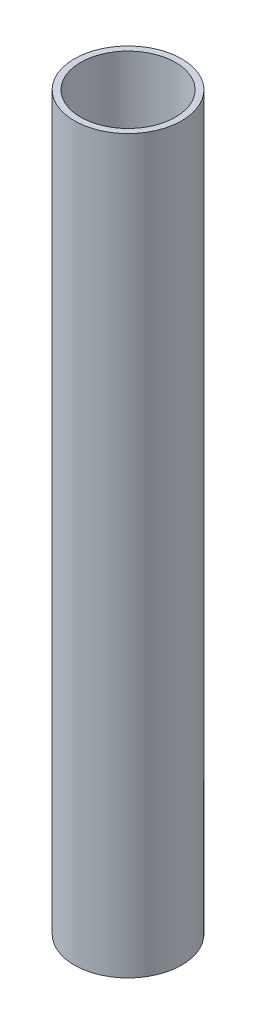
ISO-10303-21;
HEADER;
FILE_DESCRIPTION(('STEP AP214'),'2;1');
FILE_NAME('part.step','',(''),(''),'','','');
FILE_SCHEMA(('AUTOMOTIVE_DESIGN { 1 0 10303 214 1 1 1 1 }'));
ENDSEC;
DATA;
#1=APPLICATION_CONTEXT('core data for automotive mechanical design processes');
#2=APPLICATION_PROTOCOL_DEFINITION('international standard','automotive_design',2000,#1);
#3=PRODUCT_CONTEXT('',#1,'mechanical');
#4=PRODUCT('Part','Part','',(#3));
#5=PRODUCT_RELATED_PRODUCT_CATEGORY('part','',(#4));
#6=PRODUCT_DEFINITION_FORMATION('','',#4);
#7=PRODUCT_DEFINITION_CONTEXT('part definition',#1,'design');
#8=PRODUCT_DEFINITION('design','',#6,#7);
#9=PRODUCT_DEFINITION_SHAPE('','',#8);
#10=(LENGTH_UNIT() NAMED_UNIT(*) SI_UNIT(.MILLI.,.METRE.));
#11=(NAMED_UNIT(*) PLANE_ANGLE_UNIT() SI_UNIT($,.RADIAN.));
#12=(NAMED_UNIT(*) SI_UNIT($,.STERADIAN.) SOLID_ANGLE_UNIT());
#13=UNCERTAINTY_MEASURE_WITH_UNIT(LENGTH_MEASURE(1.E-05),#10,'distance_accuracy_value','');
#14=(GEOMETRIC_REPRESENTATION_CONTEXT(3) GLOBAL_UNCERTAINTY_ASSIGNED_CONTEXT((#13)) GLOBAL_UNIT_ASSIGNED_CONTEXT((#10,
#11,#12)) REPRESENTATION_CONTEXT('',''));
#15=CARTESIAN_POINT('',(0.,0.,0.));
#16=DIRECTION('',(0.,0.,1.));
#17=DIRECTION('',(1.,0.,0.));
#18=AXIS2_PLACEMENT_3D('',#15,#16,#17);
#19=CARTESIAN_POINT('',(-96.8375000000002,19.05,0.));
#20=DIRECTION('',(0.,-1.,0.));
#21=DIRECTION('',(0.,0.,-1.));
#22=AXIS2_PLACEMENT_3D('',#19,#20,#21);
#23=PLANE('',#22);
#24=CARTESIAN_POINT('',(0.,19.05,0.));
#25=DIRECTION('',(0.,-1.,0.));
#26=DIRECTION('',(0.,0.,-1.));
#27=AXIS2_PLACEMENT_3D('',#24,#25,#26);
#28=CIRCLE('',#27,109.537500000001);
#29=CARTESIAN_POINT('',(0.,19.05,-109.537500000001));
#30=VERTEX_POINT('',#29);
#31=EDGE_CURVE('E10',#30,#30,#28,.T.);
#32=ORIENTED_EDGE('',*,*,#31,.T.);
#33=EDGE_LOOP('',(#32));
#34=FACE_BOUND('',#33,.T.);
#35=CARTESIAN_POINT('',(0.,19.05,0.));
#36=DIRECTION('',(0.,-1.,0.));
#37=DIRECTION('',(0.,0.,-1.));
#38=AXIS2_PLACEMENT_3D('',#35,#36,#37);
#39=CIRCLE('',#38,96.8375000000002);
#40=CARTESIAN_POINT('',(0.,19.05,-96.8375000000002));
#41=VERTEX_POINT('',#40);
#42=EDGE_CURVE('E49',#41,#41,#39,.T.);
#43=ORIENTED_EDGE('',*,*,#42,.F.);
#44=EDGE_LOOP('',(#43));
#45=FACE_BOUND('',#44,.T.);
#46=ADVANCED_FACE('F35',(#34,#45),#23,.T.);
#47=CARTESIAN_POINT('',(0.,0.,0.));
#48=DIRECTION('',(0.,-1.,0.));
#49=DIRECTION('',(0.,0.,-1.));
#50=AXIS2_PLACEMENT_3D('',#47,#48,#49);
#51=CYLINDRICAL_SURFACE('',#50,109.537500000001);
#52=CARTESIAN_POINT('',(0.,1511.3,0.));
#53=DIRECTION('',(0.,-1.,0.));
#54=DIRECTION('',(0.,0.,-1.));
#55=AXIS2_PLACEMENT_3D('',#52,#53,#54);
#56=CIRCLE('',#55,109.537500000001);
#57=CARTESIAN_POINT('',(0.,1511.3,-109.537500000001));
#58=VERTEX_POINT('',#57);
#59=EDGE_CURVE('E41',#58,#58,#56,.T.);
#60=ORIENTED_EDGE('',*,*,#59,.T.);
#61=EDGE_LOOP('',(#60));
#62=FACE_BOUND('',#61,.T.);
#63=ORIENTED_EDGE('',*,*,#31,.F.);
#64=EDGE_LOOP('',(#63));
#65=FACE_BOUND('',#64,.T.);
#66=ADVANCED_FACE('F58',(#62,#65),#51,.T.);
#67=CARTESIAN_POINT('',(-96.8375000000002,1511.3,0.));
#68=DIRECTION('',(0.,-1.,0.));
#69=DIRECTION('',(0.,0.,-1.));
#70=AXIS2_PLACEMENT_3D('',#67,#68,#69);
#71=PLANE('',#70);
#72=ORIENTED_EDGE('',*,*,#59,.F.);
#73=EDGE_LOOP('',(#72));
#74=FACE_BOUND('',#73,.T.);
#75=CARTESIAN_POINT('',(0.,1511.3,0.));
#76=DIRECTION('',(0.,-1.,0.));
#77=DIRECTION('',(0.,0.,-1.));
#78=AXIS2_PLACEMENT_3D('',#75,#76,#77);
#79=CIRCLE('',#78,96.8375000000002);
#80=CARTESIAN_POINT('',(0.,1511.3,-96.8375000000002));
#81=VERTEX_POINT('',#80);
#82=EDGE_CURVE('E45',#81,#81,#79,.T.);
#83=ORIENTED_EDGE('',*,*,#82,.T.);
#84=EDGE_LOOP('',(#83));
#85=FACE_BOUND('',#84,.T.);
#86=ADVANCED_FACE('F62',(#74,#85),#71,.F.);
#87=CARTESIAN_POINT('',(0.,0.,0.));
#88=DIRECTION('',(0.,-1.,0.));
#89=DIRECTION('',(0.,0.,-1.));
#90=AXIS2_PLACEMENT_3D('',#87,#88,#89);
#91=CYLINDRICAL_SURFACE('',#90,96.8375000000002);
#92=ORIENTED_EDGE('',*,*,#82,.F.);
#93=EDGE_LOOP('',(#92));
#94=FACE_BOUND('',#93,.T.);
#95=ORIENTED_EDGE('',*,*,#42,.T.);
#96=EDGE_LOOP('',(#95));
#97=FACE_BOUND('',#96,.T.);
#98=ADVANCED_FACE('F55',(#94,#97),#91,.F.);
#99=CLOSED_SHELL('',(#46,#66,#86,#98));
#100=MANIFOLD_SOLID_BREP('B2',#99);
#101=ADVANCED_BREP_SHAPE_REPRESENTATION('',(#18,#100),#14);
#102=SHAPE_DEFINITION_REPRESENTATION(#9,#101);
ENDSEC;
END-ISO-10303-21;
